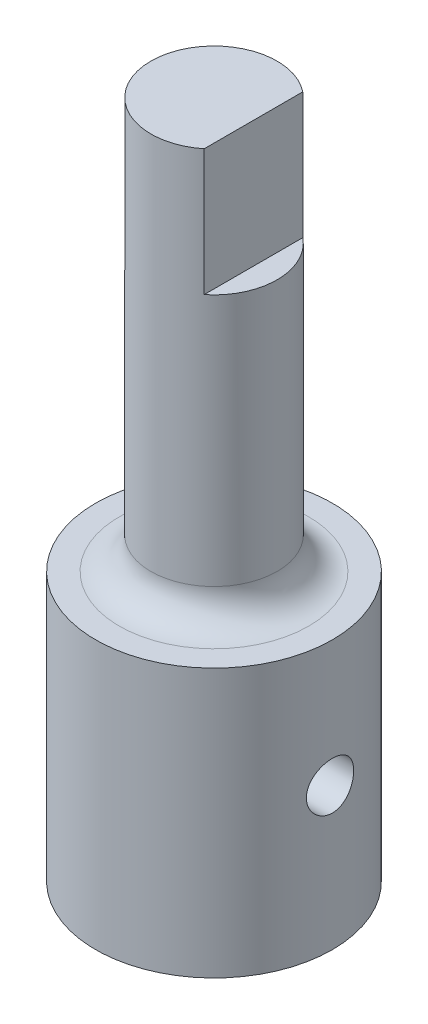
ISO-10303-21;
HEADER;
FILE_DESCRIPTION(('STEP AP214'),'2;1');
FILE_NAME('part.step','',(''),(''),'','','');
FILE_SCHEMA(('AUTOMOTIVE_DESIGN { 1 0 10303 214 1 1 1 1 }'));
ENDSEC;
DATA;
#1=APPLICATION_CONTEXT('core data for automotive mechanical design processes');
#2=APPLICATION_PROTOCOL_DEFINITION('international standard','automotive_design',2000,#1);
#3=PRODUCT_CONTEXT('',#1,'mechanical');
#4=PRODUCT('Part','Part','',(#3));
#5=PRODUCT_RELATED_PRODUCT_CATEGORY('part','',(#4));
#6=PRODUCT_DEFINITION_FORMATION('','',#4);
#7=PRODUCT_DEFINITION_CONTEXT('part definition',#1,'design');
#8=PRODUCT_DEFINITION('design','',#6,#7);
#9=PRODUCT_DEFINITION_SHAPE('','',#8);
#10=(LENGTH_UNIT() NAMED_UNIT(*) SI_UNIT(.MILLI.,.METRE.));
#11=(NAMED_UNIT(*) PLANE_ANGLE_UNIT() SI_UNIT($,.RADIAN.));
#12=(NAMED_UNIT(*) SI_UNIT($,.STERADIAN.) SOLID_ANGLE_UNIT());
#13=UNCERTAINTY_MEASURE_WITH_UNIT(LENGTH_MEASURE(1.E-05),#10,'distance_accuracy_value','');
#14=(GEOMETRIC_REPRESENTATION_CONTEXT(3) GLOBAL_UNCERTAINTY_ASSIGNED_CONTEXT((#13)) GLOBAL_UNIT_ASSIGNED_CONTEXT((#10,
#11,#12)) REPRESENTATION_CONTEXT('',''));
#15=CARTESIAN_POINT('',(0.,0.,0.));
#16=DIRECTION('',(0.,0.,1.));
#17=DIRECTION('',(1.,0.,0.));
#18=AXIS2_PLACEMENT_3D('',#15,#16,#17);
#19=CARTESIAN_POINT('',(0.,-26.,0.));
#20=DIRECTION('',(0.,1.,0.));
#21=DIRECTION('',(-1.,0.,0.));
#22=AXIS2_PLACEMENT_3D('',#19,#20,#21);
#23=CYLINDRICAL_SURFACE('',#22,7.5);
#24=CARTESIAN_POINT('',(0.,-26.,0.));
#25=DIRECTION('',(0.,1.,0.));
#26=DIRECTION('',(-1.,0.,0.));
#27=AXIS2_PLACEMENT_3D('',#24,#25,#26);
#28=CIRCLE('',#27,7.5);
#29=CARTESIAN_POINT('',(-7.5,-26.,0.));
#30=VERTEX_POINT('',#29);
#31=EDGE_CURVE('E85',#30,#30,#28,.T.);
#32=ORIENTED_EDGE('',*,*,#31,.F.);
#33=EDGE_LOOP('',(#32));
#34=FACE_BOUND('',#33,.T.);
#35=CARTESIAN_POINT('',(0.,-43.,0.));
#36=DIRECTION('',(0.,1.,0.));
#37=DIRECTION('',(-1.,0.,0.));
#38=AXIS2_PLACEMENT_3D('',#35,#36,#37);
#39=CIRCLE('',#38,7.5);
#40=CARTESIAN_POINT('',(-7.5,-43.,0.));
#41=VERTEX_POINT('',#40);
#42=EDGE_CURVE('E90',#41,#41,#39,.T.);
#43=ORIENTED_EDGE('',*,*,#42,.T.);
#44=EDGE_LOOP('',(#43));
#45=FACE_BOUND('',#44,.T.);
#46=CARTESIAN_POINT('',(7.5,-32.5,0.));
#47=CARTESIAN_POINT('',(7.49999846371307,-32.5000030667475,0.0833653601889499));
#48=CARTESIAN_POINT('',(7.49859577767347,-32.5069732644515,0.166769490302283));
#49=CARTESIAN_POINT('',(7.49313548434847,-32.5346477501729,0.331220261533529));
#50=CARTESIAN_POINT('',(7.48907576790279,-32.5553629492023,0.412264976312034));
#51=CARTESIAN_POINT('',(7.4787547391743,-32.6098619104312,0.56959545789497));
#52=CARTESIAN_POINT('',(7.47249553615077,-32.643633155267,0.645885701899702));
#53=CARTESIAN_POINT('',(7.45845597052972,-32.7232483712669,0.79171198329634));
#54=CARTESIAN_POINT('',(7.4506756985356,-32.7690916234108,0.86124842261372));
#55=CARTESIAN_POINT('',(7.43433247994955,-32.8722077414372,0.9925402159723));
#56=CARTESIAN_POINT('',(7.42576118256521,-32.9296125330868,1.05419092673779));
#57=CARTESIAN_POINT('',(7.40886270678883,-33.0539386245875,1.16705513491204));
#58=CARTESIAN_POINT('',(7.40053554750636,-33.1208606670027,1.21826781715564));
#59=CARTESIAN_POINT('',(7.38498662718923,-33.2630742895178,1.30924763002143));
#60=CARTESIAN_POINT('',(7.37777561047419,-33.3384364656945,1.3489064082988));
#61=CARTESIAN_POINT('',(7.36539402087627,-33.4949227285061,1.41495849987046));
#62=CARTESIAN_POINT('',(7.36022324642943,-33.5760462450195,1.44135312365586));
#63=CARTESIAN_POINT('',(7.35259207878307,-33.7406265458619,1.47978794982724));
#64=CARTESIAN_POINT('',(7.35009705160781,-33.8240388162133,1.49201174693817));
#65=CARTESIAN_POINT('',(7.34799562590941,-33.9917647320465,1.50232819158918));
#66=CARTESIAN_POINT('',(7.34838893201761,-34.0760782844802,1.50042228407025));
#67=CARTESIAN_POINT('',(7.35198826722277,-34.2418701820315,1.48268185965273));
#68=CARTESIAN_POINT('',(7.35515179288145,-34.323372108441,1.46705781036586));
#69=CARTESIAN_POINT('',(7.36386819240002,-34.4825741149945,1.42265682693458));
#70=CARTESIAN_POINT('',(7.36942118036668,-34.5602740133785,1.39387926465102));
#71=CARTESIAN_POINT('',(7.38233427750612,-34.7102728925554,1.32378717551208));
#72=CARTESIAN_POINT('',(7.38970634720557,-34.7825318193538,1.28238922684817));
#73=CARTESIAN_POINT('',(7.40541928159593,-34.9191562749592,1.18829036185902));
#74=CARTESIAN_POINT('',(7.41376025757549,-34.9835208952767,1.13558814653524));
#75=CARTESIAN_POINT('',(7.43065531862193,-35.1037441036854,1.01924990184087));
#76=CARTESIAN_POINT('',(7.43921053816357,-35.1594288517887,0.955434241818665));
#77=CARTESIAN_POINT('',(7.45543273071613,-35.2593307694518,0.819277536093012));
#78=CARTESIAN_POINT('',(7.4630996923346,-35.3035477919404,0.746936381069081));
#79=CARTESIAN_POINT('',(7.47670035241331,-35.379291263839,0.595589080318379));
#80=CARTESIAN_POINT('',(7.48263133272408,-35.4107978404668,0.516572729377948));
#81=CARTESIAN_POINT('',(7.49207113481787,-35.4600407110578,0.354223464672997));
#82=CARTESIAN_POINT('',(7.49558025000797,-35.4777786731104,0.270891075108675));
#83=CARTESIAN_POINT('',(7.49974007800302,-35.4987346806914,0.103769108440726));
#84=CARTESIAN_POINT('',(7.50043761978705,-35.5021906293104,0.0200104924883642));
#85=CARTESIAN_POINT('',(7.49902577895154,-35.4951252115867,-0.146887401289072));
#86=CARTESIAN_POINT('',(7.49691655412169,-35.4846046309711,-0.230026713665691));
#87=CARTESIAN_POINT('',(7.49015748012027,-35.4500824396841,-0.392558489919813));
#88=CARTESIAN_POINT('',(7.4855306460631,-35.4262028972531,-0.471977922509857));
#89=CARTESIAN_POINT('',(7.47425328091549,-35.3657740260163,-0.625685441249503));
#90=CARTESIAN_POINT('',(7.4676025982134,-35.3292237479847,-0.699973142456311));
#91=CARTESIAN_POINT('',(7.45289867299942,-35.243976264023,-0.842311760529329));
#92=CARTESIAN_POINT('',(7.44482925655578,-35.1951358284416,-0.910275190128284));
#93=CARTESIAN_POINT('',(7.42822102244824,-35.0868862131891,-1.03712702867881));
#94=CARTESIAN_POINT('',(7.41968215452582,-35.0274759004002,-1.09601446339615));
#95=CARTESIAN_POINT('',(7.40293955335448,-34.8986899721633,-1.20396088616127));
#96=CARTESIAN_POINT('',(7.39474290349956,-34.829176383668,-1.25285655367298));
#97=CARTESIAN_POINT('',(7.37976287694292,-34.682782957965,-1.33827813007681));
#98=CARTESIAN_POINT('',(7.37297944370014,-34.6059034156397,-1.37480453388435));
#99=CARTESIAN_POINT('',(7.36165110876574,-34.4473476307757,-1.43422776237294));
#100=CARTESIAN_POINT('',(7.3570946230828,-34.3656987381845,-1.45719524968658));
#101=CARTESIAN_POINT('',(7.35071155188038,-34.1995998197636,-1.4890629774408));
#102=CARTESIAN_POINT('',(7.34888461036667,-34.115150160686,-1.49796505233767));
#103=CARTESIAN_POINT('',(7.34818724447069,-33.9474867031835,-1.5013813663012));
#104=CARTESIAN_POINT('',(7.34926378783951,-33.8642782766095,-1.49615368210635));
#105=CARTESIAN_POINT('',(7.35413360226921,-33.6999525251425,-1.47202845615009));
#106=CARTESIAN_POINT('',(7.35792685150754,-33.6188351834578,-1.45313102419395));
#107=CARTESIAN_POINT('',(7.36777896328738,-33.4611584331392,-1.40231785274843));
#108=CARTESIAN_POINT('',(7.37383231528246,-33.3845884592464,-1.37043376007602));
#109=CARTESIAN_POINT('',(7.38752572461255,-33.2378444188983,-1.29458196690241));
#110=CARTESIAN_POINT('',(7.39516591498341,-33.1676708894123,-1.25061325316232));
#111=CARTESIAN_POINT('',(7.41133440784838,-33.0344266417745,-1.15095887217962));
#112=CARTESIAN_POINT('',(7.41987559364549,-32.9714968520986,-1.09508683085277));
#113=CARTESIAN_POINT('',(7.43679122807932,-32.8558206917062,-0.973596553519709));
#114=CARTESIAN_POINT('',(7.44516563794777,-32.8030766645241,-0.90797608073));
#115=CARTESIAN_POINT('',(7.46090748581957,-32.7087480340803,-0.768026443632368));
#116=CARTESIAN_POINT('',(7.46826346828869,-32.66728599508,-0.693613326644751));
#117=CARTESIAN_POINT('',(7.481026876275,-32.5975208161051,-0.538749541411096));
#118=CARTESIAN_POINT('',(7.48643605707924,-32.5692058157013,-0.458304391294685));
#119=CARTESIAN_POINT('',(7.49364558893056,-32.5320220779329,-0.314732233385666));
#120=CARTESIAN_POINT('',(7.49601454737678,-32.5200352094384,-0.252422496020675));
#121=CARTESIAN_POINT('',(7.49919231209839,-32.5040231314624,-0.1267492878151));
#122=CARTESIAN_POINT('',(7.50000116809733,-32.4999976682353,-0.0633858506229282));
#123=CARTESIAN_POINT('',(7.5,-32.5,0.));
#124=B_SPLINE_CURVE_WITH_KNOTS('',3,(#46,#47,#48,#49,#50,#51,#52,#53,#54,#55,#56,#57,#58,#59,
#60,#61,#62,#63,#64,#65,#66,#67,#68,#69,#70,#71,#72,#73,#74,#75,#76,#77,#78,#79,#80,#81,#82,#83,
#84,#85,#86,#87,#88,#89,#90,#91,#92,#93,#94,#95,#96,#97,#98,#99,#100,#101,#102,#103,#104,#105,
#106,#107,#108,#109,#110,#111,#112,#113,#114,#115,#116,#117,#118,#119,#120,#121,#122,#123),
.UNSPECIFIED.,.T.,.F.,(4,2,2,2,2,2,2,2,2,2,2,2,2,2,2,2,2,2,2,2,2,2,2,2,2,2,2,2,2,2,2,2,2,2,2,2,
2,2,4),(0.,0.249864195991887,0.499926976036986,0.749750602875514,0.999559353346297,
1.25239900516828,1.50525839512105,1.76041792508884,2.01555224047797,2.2673427765538,
2.51910756421838,2.76707590509417,3.01505608880595,3.26471235305389,3.51439732124506,
3.76857378737027,4.02275351309731,4.27732912281036,4.53187388547054,4.78216103514398,
5.03243411486802,5.28045680926086,5.52849808824034,5.77957599050039,6.03068082518896,
6.28560942868839,6.540527830852,6.79410571549086,7.04765052495623,7.29659583851554,
7.54553915238914,7.79387941879666,8.04224051372801,8.29482114358716,8.54745981799397,
8.80274245013457,9.05779433276279,9.24778162934842,9.43776287056495),.UNSPECIFIED.);
#125=CARTESIAN_POINT('',(7.5,-32.5,0.));
#126=VERTEX_POINT('',#125);
#127=EDGE_CURVE('E80',#126,#126,#124,.T.);
#128=ORIENTED_EDGE('',*,*,#127,.F.);
#129=EDGE_LOOP('',(#128));
#130=FACE_BOUND('',#129,.T.);
#131=ADVANCED_FACE('F33',(#34,#45,#130),#23,.T.);
#132=CARTESIAN_POINT('',(0.,-26.,0.));
#133=DIRECTION('',(0.,1.,0.));
#134=DIRECTION('',(-1.,0.,0.));
#135=AXIS2_PLACEMENT_3D('',#132,#133,#134);
#136=CYLINDRICAL_SURFACE('',#135,3.);
#137=CARTESIAN_POINT('',(0.,-29.,0.));
#138=DIRECTION('',(0.,1.,0.));
#139=DIRECTION('',(-1.,0.,0.));
#140=AXIS2_PLACEMENT_3D('',#137,#138,#139);
#141=CIRCLE('',#140,3.);
#142=CARTESIAN_POINT('',(-3.,-29.,0.));
#143=VERTEX_POINT('',#142);
#144=EDGE_CURVE('E73',#143,#143,#141,.T.);
#145=ORIENTED_EDGE('',*,*,#144,.T.);
#146=EDGE_LOOP('',(#145));
#147=FACE_BOUND('',#146,.T.);
#148=CARTESIAN_POINT('',(0.,-43.,0.));
#149=DIRECTION('',(0.,1.,0.));
#150=DIRECTION('',(-1.,0.,0.));
#151=AXIS2_PLACEMENT_3D('',#148,#149,#150);
#152=CIRCLE('',#151,3.);
#153=CARTESIAN_POINT('',(-3.,-43.,0.));
#154=VERTEX_POINT('',#153);
#155=EDGE_CURVE('E149',#154,#154,#152,.T.);
#156=ORIENTED_EDGE('',*,*,#155,.F.);
#157=EDGE_LOOP('',(#156));
#158=FACE_BOUND('',#157,.T.);
#159=CARTESIAN_POINT('',(2.59807621135332,-34.,1.5));
#160=CARTESIAN_POINT('',(2.59808302092689,-33.9218382877071,1.4999945446118));
#161=CARTESIAN_POINT('',(2.60165701781635,-33.8435778827124,1.49384995609983));
#162=CARTESIAN_POINT('',(2.61543549678079,-33.6894591029843,1.46958481484708));
#163=CARTESIAN_POINT('',(2.62565391083339,-33.6136061274349,1.45143909683127));
#164=CARTESIAN_POINT('',(2.65124019908098,-33.4668225034841,1.40414992304972));
#165=CARTESIAN_POINT('',(2.66658065209878,-33.3958680212896,1.3750649287406));
#166=CARTESIAN_POINT('',(2.70063997225287,-33.2598636970049,1.30690128806456));
#167=CARTESIAN_POINT('',(2.71935902214097,-33.1948141746063,1.26782210105366));
#168=CARTESIAN_POINT('',(2.75995303586162,-33.0665414071637,1.17699981079632));
#169=CARTESIAN_POINT('',(2.7819609545693,-33.0039112964897,1.12447805421566));
#170=CARTESIAN_POINT('',(2.82557974178559,-32.8878874173899,1.0098807114217));
#171=CARTESIAN_POINT('',(2.84719040746875,-32.8344982561247,0.947800388673435));
#172=CARTESIAN_POINT('',(2.88932215429424,-32.7349492732785,0.810734345121813));
#173=CARTESIAN_POINT('',(2.90967159627259,-32.6895193482107,0.735160783518858));
#174=CARTESIAN_POINT('',(2.94526134149294,-32.6122887201314,0.576235539899254));
#175=CARTESIAN_POINT('',(2.96050486775613,-32.5804794157942,0.49288880720723));
#176=CARTESIAN_POINT('',(2.98320691866356,-32.5337430080483,0.327067415888962));
#177=CARTESIAN_POINT('',(2.99114220331338,-32.5177757104667,0.244952685733223));
#178=CARTESIAN_POINT('',(3.00011375769101,-32.4997508219874,0.0788559430467695));
#179=CARTESIAN_POINT('',(3.00115420176885,-32.4976848148064,-0.00512490876561017));
#180=CARTESIAN_POINT('',(2.99644472874675,-32.5071200109555,-0.164748786635626));
#181=CARTESIAN_POINT('',(2.99127743838241,-32.5174570232818,-0.240481798765187));
#182=CARTESIAN_POINT('',(2.97561367889621,-32.549321265857,-0.388970657877484));
#183=CARTESIAN_POINT('',(2.96511681099591,-32.5708493334643,-0.46172628164089));
#184=CARTESIAN_POINT('',(2.93957374931482,-32.6246238491347,-0.603464087354335));
#185=CARTESIAN_POINT('',(2.92446662293799,-32.6570144697581,-0.672380135272773));
#186=CARTESIAN_POINT('',(2.89106468980031,-32.7313951243022,-0.803965202269999));
#187=CARTESIAN_POINT('',(2.87276874236226,-32.7733885949535,-0.866631973257974));
#188=CARTESIAN_POINT('',(2.83266591598844,-32.8703430272995,-0.990260491347297));
#189=CARTESIAN_POINT('',(2.81069063997263,-32.926154542489,-1.05050111254405));
#190=CARTESIAN_POINT('',(2.76681510880217,-33.0468845873953,-1.16115655544667));
#191=CARTESIAN_POINT('',(2.74491492398443,-33.1118100584111,-1.21156381736135));
#192=CARTESIAN_POINT('',(2.70216234138727,-33.2539722886361,-1.30425800196332));
#193=CARTESIAN_POINT('',(2.68146479986061,-33.3317290345813,-1.34582597246708));
#194=CARTESIAN_POINT('',(2.64563175417864,-33.4944065070385,-1.41497866950185));
#195=CARTESIAN_POINT('',(2.63049045069101,-33.5793196495263,-1.44257798731634));
#196=CARTESIAN_POINT('',(2.60916953725552,-33.7468217669242,-1.48077031653756));
#197=CARTESIAN_POINT('',(2.60237483772745,-33.8290616785653,-1.49253768317997));
#198=CARTESIAN_POINT('',(2.59676879042414,-33.9946020122748,-1.50227541991714));
#199=CARTESIAN_POINT('',(2.59795180333967,-34.0779016436797,-1.50025553597254));
#200=CARTESIAN_POINT('',(2.60751504810877,-34.2334808778681,-1.48355406501595));
#201=CARTESIAN_POINT('',(2.61509381259981,-34.3059691766619,-1.4702817250687));
#202=CARTESIAN_POINT('',(2.63541032327012,-34.4475516794064,-1.43354442694866));
#203=CARTESIAN_POINT('',(2.64814974007551,-34.5166447761199,-1.41007616793542));
#204=CARTESIAN_POINT('',(2.67804333119485,-34.653116996354,-1.35247138290733));
#205=CARTESIAN_POINT('',(2.69537464864595,-34.7202685252803,-1.31789109553908));
#206=CARTESIAN_POINT('',(2.73234179245875,-34.8482039073085,-1.23943059602371));
#207=CARTESIAN_POINT('',(2.75197880032722,-34.9089844652699,-1.19554560649833));
#208=CARTESIAN_POINT('',(2.79431997684504,-35.0304681512853,-1.09325575079828));
#209=CARTESIAN_POINT('',(2.81709874731434,-35.0901957260765,-1.03371790847245));
#210=CARTESIAN_POINT('',(2.86101352466839,-35.1991183569904,-0.90510674309743));
#211=CARTESIAN_POINT('',(2.88214897511564,-35.2483098553458,-0.836030211983016));
#212=CARTESIAN_POINT('',(2.92112042536436,-35.3358605889252,-0.68780304383813));
#213=CARTESIAN_POINT('',(2.93885462508044,-35.3738996773164,-0.608434646361164));
#214=CARTESIAN_POINT('',(2.96825032438952,-35.4357068557861,-0.443283546961617));
#215=CARTESIAN_POINT('',(2.9799171551456,-35.4594874770494,-0.357506552088258));
#216=CARTESIAN_POINT('',(2.99501262272824,-35.490052846262,-0.19046952349562));
#217=CARTESIAN_POINT('',(2.99909891862287,-35.4981968138142,-0.109517165775681));
#218=CARTESIAN_POINT('',(3.00063195562697,-35.5012648981816,0.0526889789268084));
#219=CARTESIAN_POINT('',(2.99808102100335,-35.4961936427853,0.133942650442633));
#220=CARTESIAN_POINT('',(2.98700953256884,-35.4738753898066,0.288806988475724));
#221=CARTESIAN_POINT('',(2.97889342001985,-35.4574527261135,0.3625684767169));
#222=CARTESIAN_POINT('',(2.95788140495135,-35.4140095010455,0.506168928275431));
#223=CARTESIAN_POINT('',(2.94498481699194,-35.3869874198598,0.576007327433267));
#224=CARTESIAN_POINT('',(2.9148889612218,-35.321909421751,0.71313510936733));
#225=CARTESIAN_POINT('',(2.89752925798199,-35.2834310151882,0.780187714050072));
#226=CARTESIAN_POINT('',(2.86032199712739,-35.1970631037114,0.90716196272104));
#227=CARTESIAN_POINT('',(2.84047329837541,-35.1491692763265,0.967080311122365));
#228=CARTESIAN_POINT('',(2.79792915339941,-35.0398042914659,1.08437100623534));
#229=CARTESIAN_POINT('',(2.77514698517547,-34.9774562687842,1.14089652680891));
#230=CARTESIAN_POINT('',(2.73094614244278,-34.8438239183053,1.24299493109202));
#231=CARTESIAN_POINT('',(2.70952868642798,-34.7725317686985,1.28855812501509));
#232=CARTESIAN_POINT('',(2.66999407957374,-34.6200450301286,1.36864661967849));
#233=CARTESIAN_POINT('',(2.65200261384405,-34.5386087033069,1.40277759894141));
#234=CARTESIAN_POINT('',(2.62299234492527,-34.3700013934903,1.45631806425962));
#235=CARTESIAN_POINT('',(2.61195024221553,-34.282850666631,1.47577678676302));
#236=CARTESIAN_POINT('',(2.60293908902686,-34.162291966522,1.49155051179662));
#237=CARTESIAN_POINT('',(2.60112193507728,-34.1299481584032,1.49471415744578));
#238=CARTESIAN_POINT('',(2.59868903831625,-34.0650752789766,1.49894010763495));
#239=CARTESIAN_POINT('',(2.59807337587664,-34.0325461954212,1.50000227159981));
#240=CARTESIAN_POINT('',(2.59807621135332,-34.,1.5));
#241=B_SPLINE_CURVE_WITH_KNOTS('',3,(#159,#160,#161,#162,#163,#164,#165,#166,#167,#168,#169,
#170,#171,#172,#173,#174,#175,#176,#177,#178,#179,#180,#181,#182,#183,#184,#185,#186,#187,#188,
#189,#190,#191,#192,#193,#194,#195,#196,#197,#198,#199,#200,#201,#202,#203,#204,#205,#206,#207,
#208,#209,#210,#211,#212,#213,#214,#215,#216,#217,#218,#219,#220,#221,#222,#223,#224,#225,#226,
#227,#228,#229,#230,#231,#232,#233,#234,#235,#236,#237,#238,#239,#240),.UNSPECIFIED.,.T.,.F.,(4,
2,2,2,2,2,2,2,2,2,2,2,2,2,2,2,2,2,2,2,2,2,2,2,2,2,2,2,2,2,2,2,2,2,2,2,2,2,2,2,4),(0.,
0.234348183892079,0.469189339237211,0.70279289387832,0.936409088167719,1.18929346874735,
1.44230356626557,1.71236838358146,1.98226240445837,2.23295227451903,2.4834903552906,
2.71224146226808,2.94100968776183,3.17294302096721,3.40495949025409,3.65890787185337,
3.91305072368878,4.18333262594174,4.45333161317558,4.70193436281318,4.95036139782561,
5.1716127513604,5.39293578654096,5.62450944609132,5.85620229330072,6.11710115370921,
6.37808797467305,6.6459627211945,6.91360169713159,7.15668405584231,7.39968130190959,
7.6266663730724,7.85368400268021,8.09041126079209,8.3272474515108,8.58765362775103,
8.84828914267733,9.1171612355791,9.38512699504141,9.48270202777966,9.58028358741812),.UNSPECIFIED.);
#242=CARTESIAN_POINT('',(2.59807621135332,-34.,1.5));
#243=VERTEX_POINT('',#242);
#244=EDGE_CURVE('E37',#243,#243,#241,.T.);
#245=ORIENTED_EDGE('',*,*,#244,.F.);
#246=EDGE_LOOP('',(#245));
#247=FACE_BOUND('',#246,.T.);
#248=ADVANCED_FACE('F113',(#147,#158,#247),#136,.F.);
#249=CARTESIAN_POINT('',(0.,0.,0.));
#250=DIRECTION('',(0.,-1.,0.));
#251=DIRECTION('',(1.,0.,0.));
#252=AXIS2_PLACEMENT_3D('',#249,#250,#251);
#253=PLANE('',#252);
#254=CARTESIAN_POINT('',(0.,0.,0.));
#255=DIRECTION('',(0.,1.,0.));
#256=DIRECTION('',(-1.,0.,0.));
#257=AXIS2_PLACEMENT_3D('',#254,#255,#256);
#258=CIRCLE('',#257,4.);
#259=CARTESIAN_POINT('',(2.5,0.,-3.1224989991992));
#260=VERTEX_POINT('',#259);
#261=CARTESIAN_POINT('',(2.5,0.,3.1224989991992));
#262=VERTEX_POINT('',#261);
#263=EDGE_CURVE('E79',#260,#262,#258,.T.);
#264=ORIENTED_EDGE('',*,*,#263,.T.);
#265=DIRECTION('',(0.,0.,1.));
#266=VECTOR('',#265,1.);
#267=CARTESIAN_POINT('',(2.5,0.,-3.1224989991992));
#268=LINE('',#267,#266);
#269=EDGE_CURVE('E68',#260,#262,#268,.T.);
#270=ORIENTED_EDGE('',*,*,#269,.F.);
#271=EDGE_LOOP('',(#264,#270));
#272=FACE_BOUND('',#271,.T.);
#273=ADVANCED_FACE('F78',(#272),#253,.F.);
#274=CARTESIAN_POINT('',(0.,-26.,0.));
#275=DIRECTION('',(0.,1.,0.));
#276=DIRECTION('',(-1.,0.,0.));
#277=AXIS2_PLACEMENT_3D('',#274,#275,#276);
#278=CYLINDRICAL_SURFACE('',#277,4.);
#279=ORIENTED_EDGE('',*,*,#263,.F.);
#280=DIRECTION('',(0.,1.,0.));
#281=VECTOR('',#280,1.);
#282=CARTESIAN_POINT('',(2.5,-8.,-3.1224989991992));
#283=LINE('',#282,#281);
#284=CARTESIAN_POINT('',(2.5,-8.,-3.1224989991992));
#285=VERTEX_POINT('',#284);
#286=EDGE_CURVE('E64',#285,#260,#283,.T.);
#287=ORIENTED_EDGE('',*,*,#286,.F.);
#288=CARTESIAN_POINT('',(0.,-8.,0.));
#289=DIRECTION('',(0.,1.,0.));
#290=DIRECTION('',(-1.,0.,0.));
#291=AXIS2_PLACEMENT_3D('',#288,#289,#290);
#292=CIRCLE('',#291,4.);
#293=CARTESIAN_POINT('',(2.5,-8.,3.1224989991992));
#294=VERTEX_POINT('',#293);
#295=EDGE_CURVE('E11',#294,#285,#292,.T.);
#296=ORIENTED_EDGE('',*,*,#295,.F.);
#297=DIRECTION('',(0.,1.,0.));
#298=VECTOR('',#297,1.);
#299=CARTESIAN_POINT('',(2.5,-8.,3.1224989991992));
#300=LINE('',#299,#298);
#301=EDGE_CURVE('E74',#294,#262,#300,.T.);
#302=ORIENTED_EDGE('',*,*,#301,.T.);
#303=EDGE_LOOP('',(#279,#287,#296,#302));
#304=FACE_BOUND('',#303,.T.);
#305=CARTESIAN_POINT('',(0.,-24.,0.));
#306=DIRECTION('',(0.,-1.,0.));
#307=DIRECTION('',(1.,0.,0.));
#308=AXIS2_PLACEMENT_3D('',#305,#306,#307);
#309=CIRCLE('',#308,4.);
#310=CARTESIAN_POINT('',(4.,-24.,0.));
#311=VERTEX_POINT('',#310);
#312=EDGE_CURVE('E84',#311,#311,#309,.F.);
#313=ORIENTED_EDGE('',*,*,#312,.T.);
#314=EDGE_LOOP('',(#313));
#315=FACE_BOUND('',#314,.T.);
#316=ADVANCED_FACE('F82',(#304,#315),#278,.T.);
#317=CARTESIAN_POINT('',(4.,-26.,0.));
#318=DIRECTION('',(0.,-1.,0.));
#319=DIRECTION('',(1.,0.,0.));
#320=AXIS2_PLACEMENT_3D('',#317,#318,#319);
#321=PLANE('',#320);
#322=CARTESIAN_POINT('',(0.,-26.,0.));
#323=DIRECTION('',(0.,-1.,0.));
#324=DIRECTION('',(1.,0.,0.));
#325=AXIS2_PLACEMENT_3D('',#322,#323,#324);
#326=CIRCLE('',#325,6.);
#327=CARTESIAN_POINT('',(6.,-26.,0.));
#328=VERTEX_POINT('',#327);
#329=EDGE_CURVE('E46',#328,#328,#326,.T.);
#330=ORIENTED_EDGE('',*,*,#329,.T.);
#331=EDGE_LOOP('',(#330));
#332=FACE_BOUND('',#331,.T.);
#333=ORIENTED_EDGE('',*,*,#31,.T.);
#334=EDGE_LOOP('',(#333));
#335=FACE_BOUND('',#334,.T.);
#336=ADVANCED_FACE('F97',(#332,#335),#321,.F.);
#337=CARTESIAN_POINT('',(7.5,-43.,0.));
#338=DIRECTION('',(0.,1.,0.));
#339=DIRECTION('',(-1.,0.,0.));
#340=AXIS2_PLACEMENT_3D('',#337,#338,#339);
#341=PLANE('',#340);
#342=ORIENTED_EDGE('',*,*,#42,.F.);
#343=EDGE_LOOP('',(#342));
#344=FACE_BOUND('',#343,.T.);
#345=ORIENTED_EDGE('',*,*,#155,.T.);
#346=EDGE_LOOP('',(#345));
#347=FACE_BOUND('',#346,.T.);
#348=ADVANCED_FACE('F111',(#344,#347),#341,.F.);
#349=CARTESIAN_POINT('',(0.,-26.,0.));
#350=DIRECTION('',(0.,-1.,0.));
#351=DIRECTION('',(1.,0.,0.));
#352=AXIS2_PLACEMENT_3D('',#349,#350,#351);
#353=CONICAL_SURFACE('',#352,0.,0.785398163397444);
#354=ORIENTED_EDGE('',*,*,#144,.F.);
#355=EDGE_LOOP('',(#354));
#356=FACE_BOUND('',#355,.T.);
#357=CARTESIAN_POINT('',(0.,-26.,0.));
#358=VERTEX_POINT('',#357);
#359=VERTEX_LOOP('',#358);
#360=FACE_BOUND('',#359,.T.);
#361=ADVANCED_FACE('F103',(#356,#360),#353,.F.);
#362=CARTESIAN_POINT('',(0.,-24.,0.));
#363=DIRECTION('',(0.,-1.,0.));
#364=DIRECTION('',(1.,0.,0.));
#365=AXIS2_PLACEMENT_3D('',#362,#363,#364);
#366=TOROIDAL_SURFACE('',#365,6.,2.);
#367=ORIENTED_EDGE('',*,*,#329,.F.);
#368=EDGE_LOOP('',(#367));
#369=FACE_BOUND('',#368,.T.);
#370=ORIENTED_EDGE('',*,*,#312,.F.);
#371=EDGE_LOOP('',(#370));
#372=FACE_BOUND('',#371,.T.);
#373=ADVANCED_FACE('F35',(#369,#372),#366,.F.);
#374=CARTESIAN_POINT('',(0.,-8.,0.));
#375=DIRECTION('',(0.,1.,0.));
#376=DIRECTION('',(-1.,0.,0.));
#377=AXIS2_PLACEMENT_3D('',#374,#375,#376);
#378=PLANE('',#377);
#379=DIRECTION('',(0.,0.,1.));
#380=VECTOR('',#379,1.);
#381=CARTESIAN_POINT('',(2.5,-8.,-3.1224989991992));
#382=LINE('',#381,#380);
#383=EDGE_CURVE('E70',#285,#294,#382,.T.);
#384=ORIENTED_EDGE('',*,*,#383,.T.);
#385=ORIENTED_EDGE('',*,*,#295,.T.);
#386=EDGE_LOOP('',(#384,#385));
#387=FACE_BOUND('',#386,.T.);
#388=ADVANCED_FACE('F102',(#387),#378,.T.);
#389=CARTESIAN_POINT('',(2.5,-8.,-3.1224989991992));
#390=DIRECTION('',(-1.,0.,0.));
#391=DIRECTION('',(0.,-1.,0.));
#392=AXIS2_PLACEMENT_3D('',#389,#390,#391);
#393=PLANE('',#392);
#394=ORIENTED_EDGE('',*,*,#269,.T.);
#395=ORIENTED_EDGE('',*,*,#301,.F.);
#396=ORIENTED_EDGE('',*,*,#383,.F.);
#397=ORIENTED_EDGE('',*,*,#286,.T.);
#398=EDGE_LOOP('',(#394,#395,#396,#397));
#399=FACE_BOUND('',#398,.T.);
#400=ADVANCED_FACE('F66',(#399),#393,.F.);
#401=CARTESIAN_POINT('',(7.5,-34.,0.));
#402=DIRECTION('',(-1.,0.,0.));
#403=DIRECTION('',(0.,0.,1.));
#404=AXIS2_PLACEMENT_3D('',#401,#402,#403);
#405=CYLINDRICAL_SURFACE('',#404,1.5);
#406=ORIENTED_EDGE('',*,*,#244,.T.);
#407=EDGE_LOOP('',(#406));
#408=FACE_BOUND('',#407,.T.);
#409=ORIENTED_EDGE('',*,*,#127,.T.);
#410=EDGE_LOOP('',(#409));
#411=FACE_BOUND('',#410,.T.);
#412=ADVANCED_FACE('F130',(#408,#411),#405,.F.);
#413=CLOSED_SHELL('',(#131,#248,#273,#316,#336,#348,#361,#373,#388,#400,#412));
#414=MANIFOLD_SOLID_BREP('B2',#413);
#415=ADVANCED_BREP_SHAPE_REPRESENTATION('',(#18,#414),#14);
#416=SHAPE_DEFINITION_REPRESENTATION(#9,#415);
ENDSEC;
END-ISO-10303-21;
